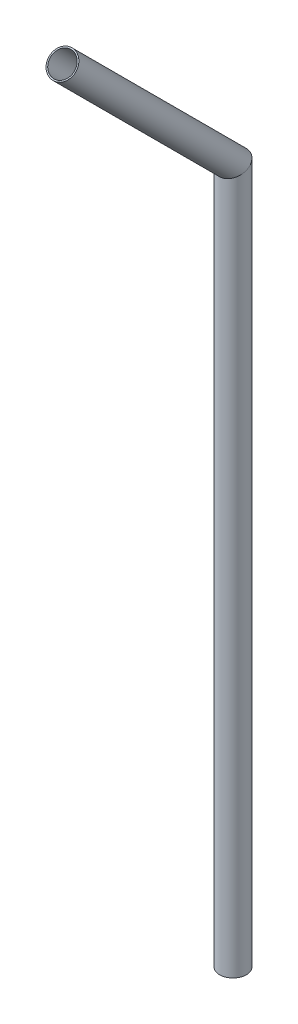
ISO-10303-21;
HEADER;
FILE_DESCRIPTION(('STEP AP214'),'2;1');
FILE_NAME('part.step','',(''),(''),'','','');
FILE_SCHEMA(('AUTOMOTIVE_DESIGN { 1 0 10303 214 1 1 1 1 }'));
ENDSEC;
DATA;
#1=APPLICATION_CONTEXT('core data for automotive mechanical design processes');
#2=APPLICATION_PROTOCOL_DEFINITION('international standard','automotive_design',2000,#1);
#3=PRODUCT_CONTEXT('',#1,'mechanical');
#4=PRODUCT('Part','Part','',(#3));
#5=PRODUCT_RELATED_PRODUCT_CATEGORY('part','',(#4));
#6=PRODUCT_DEFINITION_FORMATION('','',#4);
#7=PRODUCT_DEFINITION_CONTEXT('part definition',#1,'design');
#8=PRODUCT_DEFINITION('design','',#6,#7);
#9=PRODUCT_DEFINITION_SHAPE('','',#8);
#10=(LENGTH_UNIT() NAMED_UNIT(*) SI_UNIT(.MILLI.,.METRE.));
#11=(NAMED_UNIT(*) PLANE_ANGLE_UNIT() SI_UNIT($,.RADIAN.));
#12=(NAMED_UNIT(*) SI_UNIT($,.STERADIAN.) SOLID_ANGLE_UNIT());
#13=UNCERTAINTY_MEASURE_WITH_UNIT(LENGTH_MEASURE(1.E-05),#10,'distance_accuracy_value','');
#14=(GEOMETRIC_REPRESENTATION_CONTEXT(3) GLOBAL_UNCERTAINTY_ASSIGNED_CONTEXT((#13)) GLOBAL_UNIT_ASSIGNED_CONTEXT((#10,
#11,#12)) REPRESENTATION_CONTEXT('',''));
#15=CARTESIAN_POINT('',(0.,0.,0.));
#16=DIRECTION('',(0.,0.,1.));
#17=DIRECTION('',(1.,0.,0.));
#18=AXIS2_PLACEMENT_3D('',#15,#16,#17);
#19=CARTESIAN_POINT('',(0.,516.707463914933,-3.29253608506666));
#20=DIRECTION('',(0.,0.707106781186548,0.707106781186548));
#21=DIRECTION('',(0.,-0.707106781186548,0.707106781186548));
#22=AXIS2_PLACEMENT_3D('',#19,#20,#21);
#23=CYLINDRICAL_SURFACE('',#22,10.);
#24=CARTESIAN_POINT('',(0.,520.,0.));
#25=DIRECTION('',(0.,0.923879532511287,0.38268343236509));
#26=DIRECTION('',(0.,0.38268343236509,-0.923879532511287));
#27=AXIS2_PLACEMENT_3D('',#24,#25,#26);
#28=ELLIPSE('',#27,10.8239220029239,10.);
#29=CARTESIAN_POINT('',(0.,524.142135623731,-10.));
#30=VERTEX_POINT('',#29);
#31=EDGE_CURVE('E40',#30,#30,#28,.F.);
#32=ORIENTED_EDGE('',*,*,#31,.F.);
#33=EDGE_LOOP('',(#32));
#34=FACE_BOUND('',#33,.T.);
#35=CARTESIAN_POINT('',(0.,647.279220613579,127.279220613579));
#36=DIRECTION('',(0.,0.707106781186548,0.707106781186548));
#37=DIRECTION('',(0.,-0.707106781186548,0.707106781186548));
#38=AXIS2_PLACEMENT_3D('',#35,#36,#37);
#39=CIRCLE('',#38,10.);
#40=CARTESIAN_POINT('',(0.,640.208152801713,134.350288425444));
#41=VERTEX_POINT('',#40);
#42=EDGE_CURVE('E60',#41,#41,#39,.T.);
#43=ORIENTED_EDGE('',*,*,#42,.F.);
#44=EDGE_LOOP('',(#43));
#45=FACE_BOUND('',#44,.T.);
#46=ADVANCED_FACE('F37',(#34,#45),#23,.T.);
#47=CARTESIAN_POINT('',(0.,0.,0.));
#48=DIRECTION('',(0.,1.,0.));
#49=DIRECTION('',(0.,0.,1.));
#50=AXIS2_PLACEMENT_3D('',#47,#48,#49);
#51=CYLINDRICAL_SURFACE('',#50,10.);
#52=CARTESIAN_POINT('',(0.,0.,0.));
#53=DIRECTION('',(0.,1.,0.));
#54=DIRECTION('',(0.,0.,1.));
#55=AXIS2_PLACEMENT_3D('',#52,#53,#54);
#56=CIRCLE('',#55,10.);
#57=CARTESIAN_POINT('',(0.,0.,10.));
#58=VERTEX_POINT('',#57);
#59=EDGE_CURVE('E57',#58,#58,#56,.T.);
#60=ORIENTED_EDGE('',*,*,#59,.T.);
#61=EDGE_LOOP('',(#60));
#62=FACE_BOUND('',#61,.T.);
#63=ORIENTED_EDGE('',*,*,#31,.T.);
#64=EDGE_LOOP('',(#63));
#65=FACE_BOUND('',#64,.T.);
#66=ADVANCED_FACE('F69',(#62,#65),#51,.T.);
#67=CARTESIAN_POINT('',(0.,647.279220613579,127.279220613579));
#68=DIRECTION('',(0.,0.707106781186548,0.707106781186548));
#69=DIRECTION('',(0.,-0.707106781186548,0.707106781186548));
#70=AXIS2_PLACEMENT_3D('',#67,#68,#69);
#71=PLANE('',#70);
#72=CARTESIAN_POINT('',(0.,647.279220613579,127.279220613579));
#73=DIRECTION('',(0.,0.707106781186548,0.707106781186548));
#74=DIRECTION('',(0.,-0.707106781186548,0.707106781186548));
#75=AXIS2_PLACEMENT_3D('',#72,#73,#74);
#76=CIRCLE('',#75,9.);
#77=CARTESIAN_POINT('',(0.,640.9152595829,133.643181644257));
#78=VERTEX_POINT('',#77);
#79=EDGE_CURVE('E51',#78,#78,#76,.F.);
#80=ORIENTED_EDGE('',*,*,#79,.T.);
#81=EDGE_LOOP('',(#80));
#82=FACE_BOUND('',#81,.T.);
#83=ORIENTED_EDGE('',*,*,#42,.T.);
#84=EDGE_LOOP('',(#83));
#85=FACE_BOUND('',#84,.T.);
#86=ADVANCED_FACE('F76',(#82,#85),#71,.T.);
#87=CARTESIAN_POINT('',(0.,0.,0.));
#88=DIRECTION('',(0.,1.,0.));
#89=DIRECTION('',(0.,0.,1.));
#90=AXIS2_PLACEMENT_3D('',#87,#88,#89);
#91=PLANE('',#90);
#92=CARTESIAN_POINT('',(0.,0.,0.));
#93=DIRECTION('',(0.,1.,0.));
#94=DIRECTION('',(0.,0.,1.));
#95=AXIS2_PLACEMENT_3D('',#92,#93,#94);
#96=CIRCLE('',#95,9.);
#97=CARTESIAN_POINT('',(0.,0.,9.));
#98=VERTEX_POINT('',#97);
#99=EDGE_CURVE('E45',#98,#98,#96,.F.);
#100=ORIENTED_EDGE('',*,*,#99,.F.);
#101=EDGE_LOOP('',(#100));
#102=FACE_BOUND('',#101,.T.);
#103=ORIENTED_EDGE('',*,*,#59,.F.);
#104=EDGE_LOOP('',(#103));
#105=FACE_BOUND('',#104,.T.);
#106=ADVANCED_FACE('F86',(#102,#105),#91,.F.);
#107=CARTESIAN_POINT('',(0.,517.029646455628,-2.97035354437184));
#108=DIRECTION('',(0.,0.707106781186548,0.707106781186548));
#109=DIRECTION('',(0.,-0.707106781186548,0.707106781186548));
#110=AXIS2_PLACEMENT_3D('',#107,#108,#109);
#111=CYLINDRICAL_SURFACE('',#110,9.);
#112=CARTESIAN_POINT('',(0.,520.,0.));
#113=DIRECTION('',(0.,0.923879532511287,0.38268343236509));
#114=DIRECTION('',(0.,0.38268343236509,-0.923879532511287));
#115=AXIS2_PLACEMENT_3D('',#112,#113,#114);
#116=ELLIPSE('',#115,9.74152980263154,9.);
#117=CARTESIAN_POINT('',(0.,523.727922061358,-9.));
#118=VERTEX_POINT('',#117);
#119=EDGE_CURVE('E10',#118,#118,#116,.T.);
#120=ORIENTED_EDGE('',*,*,#119,.F.);
#121=EDGE_LOOP('',(#120));
#122=FACE_BOUND('',#121,.T.);
#123=ORIENTED_EDGE('',*,*,#79,.F.);
#124=EDGE_LOOP('',(#123));
#125=FACE_BOUND('',#124,.T.);
#126=ADVANCED_FACE('F80',(#122,#125),#111,.F.);
#127=CARTESIAN_POINT('',(0.,0.,0.));
#128=DIRECTION('',(0.,1.,0.));
#129=DIRECTION('',(0.,0.,1.));
#130=AXIS2_PLACEMENT_3D('',#127,#128,#129);
#131=CYLINDRICAL_SURFACE('',#130,9.);
#132=ORIENTED_EDGE('',*,*,#99,.T.);
#133=EDGE_LOOP('',(#132));
#134=FACE_BOUND('',#133,.T.);
#135=ORIENTED_EDGE('',*,*,#119,.T.);
#136=EDGE_LOOP('',(#135));
#137=FACE_BOUND('',#136,.T.);
#138=ADVANCED_FACE('F78',(#134,#137),#131,.F.);
#139=CLOSED_SHELL('',(#46,#66,#86,#106,#126,#138));
#140=MANIFOLD_SOLID_BREP('B2',#139);
#141=ADVANCED_BREP_SHAPE_REPRESENTATION('',(#18,#140),#14);
#142=SHAPE_DEFINITION_REPRESENTATION(#9,#141);
ENDSEC;
END-ISO-10303-21;
